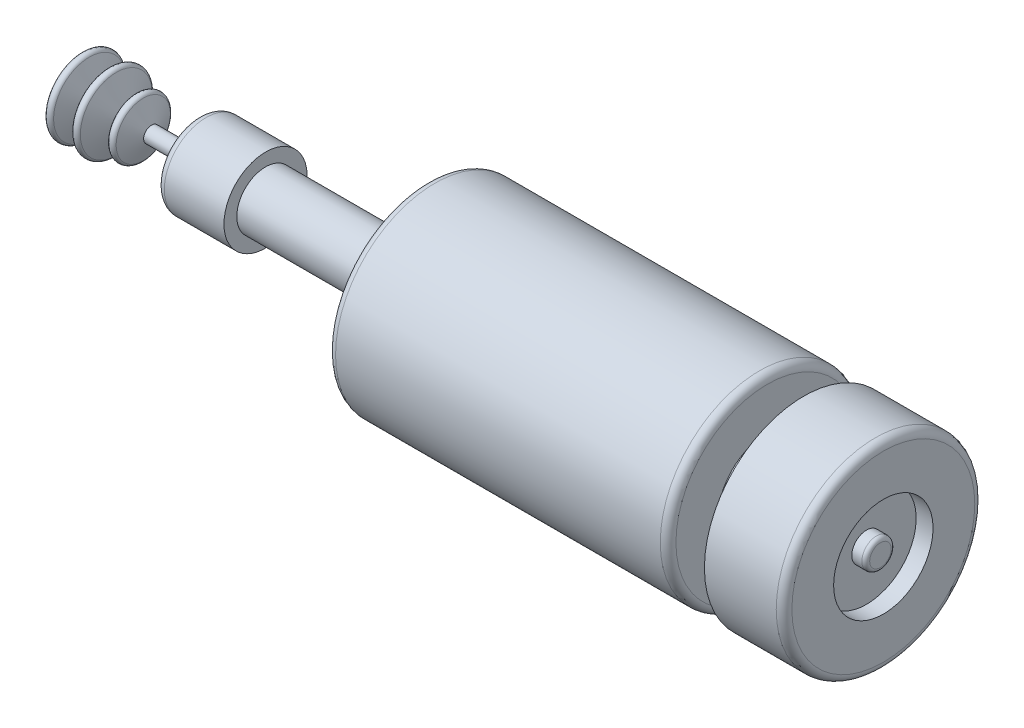
ISO-10303-21;
HEADER;
FILE_DESCRIPTION(('STEP AP214'),'2;1');
FILE_NAME('part.step','',(''),(''),'','','');
FILE_SCHEMA(('AUTOMOTIVE_DESIGN { 1 0 10303 214 1 1 1 1 }'));
ENDSEC;
DATA;
#1=APPLICATION_CONTEXT('core data for automotive mechanical design processes');
#2=APPLICATION_PROTOCOL_DEFINITION('international standard','automotive_design',2000,#1);
#3=PRODUCT_CONTEXT('',#1,'mechanical');
#4=PRODUCT('Part','Part','',(#3));
#5=PRODUCT_RELATED_PRODUCT_CATEGORY('part','',(#4));
#6=PRODUCT_DEFINITION_FORMATION('','',#4);
#7=PRODUCT_DEFINITION_CONTEXT('part definition',#1,'design');
#8=PRODUCT_DEFINITION('design','',#6,#7);
#9=PRODUCT_DEFINITION_SHAPE('','',#8);
#10=(LENGTH_UNIT() NAMED_UNIT(*) SI_UNIT(.MILLI.,.METRE.));
#11=(NAMED_UNIT(*) PLANE_ANGLE_UNIT() SI_UNIT($,.RADIAN.));
#12=(NAMED_UNIT(*) SI_UNIT($,.STERADIAN.) SOLID_ANGLE_UNIT());
#13=UNCERTAINTY_MEASURE_WITH_UNIT(LENGTH_MEASURE(1.E-05),#10,'distance_accuracy_value','');
#14=(GEOMETRIC_REPRESENTATION_CONTEXT(3) GLOBAL_UNCERTAINTY_ASSIGNED_CONTEXT((#13)) GLOBAL_UNIT_ASSIGNED_CONTEXT((#10,
#11,#12)) REPRESENTATION_CONTEXT('',''));
#15=CARTESIAN_POINT('',(0.,0.,0.));
#16=DIRECTION('',(0.,0.,1.));
#17=DIRECTION('',(1.,0.,0.));
#18=AXIS2_PLACEMENT_3D('',#15,#16,#17);
#19=CARTESIAN_POINT('',(-118.607720523507,0.,0.));
#20=DIRECTION('',(1.,0.,0.));
#21=DIRECTION('',(0.,0.,-1.));
#22=AXIS2_PLACEMENT_3D('',#19,#20,#21);
#23=CONICAL_SURFACE('',#22,4.07209805882899,1.50487260472718);
#24=CARTESIAN_POINT('',(-118.876557947232,0.,0.));
#25=VERTEX_POINT('',#24);
#26=VERTEX_LOOP('',#25);
#27=FACE_BOUND('',#26,.T.);
#28=CARTESIAN_POINT('',(-118.607720523507,0.,0.));
#29=DIRECTION('',(-1.,0.,0.));
#30=DIRECTION('',(0.,0.,1.));
#31=AXIS2_PLACEMENT_3D('',#28,#29,#30);
#32=CIRCLE('',#31,4.07209805882899);
#33=CARTESIAN_POINT('',(-118.607720523507,0.,4.07209805882899));
#34=VERTEX_POINT('',#33);
#35=EDGE_CURVE('E53',#34,#34,#32,.T.);
#36=ORIENTED_EDGE('',*,*,#35,.T.);
#37=EDGE_LOOP('',(#36));
#38=FACE_BOUND('',#37,.T.);
#39=ADVANCED_FACE('F39',(#27,#38),#23,.T.);
#40=CARTESIAN_POINT('',(86.761420325875,2.74164683024927,0.));
#41=DIRECTION('',(-1.,0.,0.));
#42=DIRECTION('',(0.,0.,1.));
#43=AXIS2_PLACEMENT_3D('',#40,#41,#42);
#44=PLANE('',#43);
#45=CARTESIAN_POINT('',(86.761420325875,0.,0.));
#46=DIRECTION('',(-1.,0.,0.));
#47=DIRECTION('',(0.,0.,1.));
#48=AXIS2_PLACEMENT_3D('',#45,#46,#47);
#49=CIRCLE('',#48,2.74164683024927);
#50=CARTESIAN_POINT('',(86.761420325875,0.,2.74164683024927));
#51=VERTEX_POINT('',#50);
#52=EDGE_CURVE('E11',#51,#51,#49,.T.);
#53=ORIENTED_EDGE('',*,*,#52,.F.);
#54=EDGE_LOOP('',(#53));
#55=FACE_BOUND('',#54,.T.);
#56=ADVANCED_FACE('F50',(#55),#44,.F.);
#57=CARTESIAN_POINT('',(85.761420325875,0.,0.));
#58=DIRECTION('',(-1.,0.,0.));
#59=DIRECTION('',(0.,0.,1.));
#60=AXIS2_PLACEMENT_3D('',#57,#58,#59);
#61=TOROIDAL_SURFACE('',#60,2.74164683024928,1.);
#62=CARTESIAN_POINT('',(85.761420325875,0.,0.));
#63=DIRECTION('',(-1.,0.,0.));
#64=DIRECTION('',(0.,0.,1.));
#65=AXIS2_PLACEMENT_3D('',#62,#63,#64);
#66=CIRCLE('',#65,3.74164683024928);
#67=CARTESIAN_POINT('',(85.761420325875,0.,3.74164683024928));
#68=VERTEX_POINT('',#67);
#69=EDGE_CURVE('E45',#68,#68,#66,.T.);
#70=ORIENTED_EDGE('',*,*,#69,.F.);
#71=EDGE_LOOP('',(#70));
#72=FACE_BOUND('',#71,.T.);
#73=ORIENTED_EDGE('',*,*,#52,.T.);
#74=EDGE_LOOP('',(#73));
#75=FACE_BOUND('',#74,.T.);
#76=ADVANCED_FACE('F166',(#72,#75),#61,.T.);
#77=CARTESIAN_POINT('',(0.,0.,0.));
#78=DIRECTION('',(-1.,0.,0.));
#79=DIRECTION('',(0.,0.,1.));
#80=AXIS2_PLACEMENT_3D('',#77,#78,#79);
#81=CYLINDRICAL_SURFACE('',#80,3.74164683024928);
#82=CARTESIAN_POINT('',(83.192728647066,0.,0.));
#83=DIRECTION('',(-1.,0.,0.));
#84=DIRECTION('',(0.,0.,1.));
#85=AXIS2_PLACEMENT_3D('',#82,#83,#84);
#86=CIRCLE('',#85,3.74164683024928);
#87=CARTESIAN_POINT('',(83.192728647066,0.,3.74164683024928));
#88=VERTEX_POINT('',#87);
#89=EDGE_CURVE('E159',#88,#88,#86,.T.);
#90=ORIENTED_EDGE('',*,*,#89,.F.);
#91=EDGE_LOOP('',(#90));
#92=FACE_BOUND('',#91,.T.);
#93=ORIENTED_EDGE('',*,*,#69,.T.);
#94=EDGE_LOOP('',(#93));
#95=FACE_BOUND('',#94,.T.);
#96=ADVANCED_FACE('F164',(#92,#95),#81,.T.);
#97=CARTESIAN_POINT('',(83.192728647066,12.6943246652966,0.));
#98=DIRECTION('',(-1.,0.,0.));
#99=DIRECTION('',(0.,0.,1.));
#100=AXIS2_PLACEMENT_3D('',#97,#98,#99);
#101=PLANE('',#100);
#102=CARTESIAN_POINT('',(83.192728647066,0.,0.));
#103=DIRECTION('',(-1.,0.,0.));
#104=DIRECTION('',(0.,0.,1.));
#105=AXIS2_PLACEMENT_3D('',#102,#103,#104);
#106=CIRCLE('',#105,12.6943246652966);
#107=CARTESIAN_POINT('',(83.192728647066,0.,12.6943246652966));
#108=VERTEX_POINT('',#107);
#109=EDGE_CURVE('E156',#108,#108,#106,.T.);
#110=ORIENTED_EDGE('',*,*,#109,.F.);
#111=EDGE_LOOP('',(#110));
#112=FACE_BOUND('',#111,.T.);
#113=ORIENTED_EDGE('',*,*,#89,.T.);
#114=EDGE_LOOP('',(#113));
#115=FACE_BOUND('',#114,.T.);
#116=ADVANCED_FACE('F178',(#112,#115),#101,.F.);
#117=CARTESIAN_POINT('',(0.,0.,0.));
#118=DIRECTION('',(-1.,0.,0.));
#119=DIRECTION('',(0.,0.,1.));
#120=AXIS2_PLACEMENT_3D('',#117,#118,#119);
#121=CYLINDRICAL_SURFACE('',#120,12.6943246652966);
#122=CARTESIAN_POINT('',(87.5,0.,0.));
#123=DIRECTION('',(-1.,0.,0.));
#124=DIRECTION('',(0.,0.,1.));
#125=AXIS2_PLACEMENT_3D('',#122,#123,#124);
#126=CIRCLE('',#125,12.6943246652966);
#127=CARTESIAN_POINT('',(87.5,0.,12.6943246652966));
#128=VERTEX_POINT('',#127);
#129=EDGE_CURVE('E153',#128,#128,#126,.T.);
#130=ORIENTED_EDGE('',*,*,#129,.F.);
#131=EDGE_LOOP('',(#130));
#132=FACE_BOUND('',#131,.T.);
#133=ORIENTED_EDGE('',*,*,#109,.T.);
#134=EDGE_LOOP('',(#133));
#135=FACE_BOUND('',#134,.T.);
#136=ADVANCED_FACE('F182',(#132,#135),#121,.F.);
#137=CARTESIAN_POINT('',(87.5,12.6943246652966,0.));
#138=DIRECTION('',(-1.,0.,0.));
#139=DIRECTION('',(0.,0.,1.));
#140=AXIS2_PLACEMENT_3D('',#137,#138,#139);
#141=PLANE('',#140);
#142=CARTESIAN_POINT('',(87.5,0.,0.));
#143=DIRECTION('',(-1.,0.,0.));
#144=DIRECTION('',(0.,0.,1.));
#145=AXIS2_PLACEMENT_3D('',#142,#143,#144);
#146=CIRCLE('',#145,23.3547064368853);
#147=CARTESIAN_POINT('',(87.5,0.,23.3547064368853));
#148=VERTEX_POINT('',#147);
#149=EDGE_CURVE('E150',#148,#148,#146,.T.);
#150=ORIENTED_EDGE('',*,*,#149,.F.);
#151=EDGE_LOOP('',(#150));
#152=FACE_BOUND('',#151,.T.);
#153=ORIENTED_EDGE('',*,*,#129,.T.);
#154=EDGE_LOOP('',(#153));
#155=FACE_BOUND('',#154,.T.);
#156=ADVANCED_FACE('F186',(#152,#155),#141,.F.);
#157=CARTESIAN_POINT('',(85.5,0.,0.));
#158=DIRECTION('',(-1.,0.,0.));
#159=DIRECTION('',(0.,0.,1.));
#160=AXIS2_PLACEMENT_3D('',#157,#158,#159);
#161=TOROIDAL_SURFACE('',#160,23.3547064368854,2.);
#162=CARTESIAN_POINT('',(85.5,0.,0.));
#163=DIRECTION('',(-1.,0.,0.));
#164=DIRECTION('',(0.,0.,1.));
#165=AXIS2_PLACEMENT_3D('',#162,#163,#164);
#166=CIRCLE('',#165,25.3547064368854);
#167=CARTESIAN_POINT('',(85.5,0.,25.3547064368854));
#168=VERTEX_POINT('',#167);
#169=EDGE_CURVE('E147',#168,#168,#166,.T.);
#170=ORIENTED_EDGE('',*,*,#169,.F.);
#171=EDGE_LOOP('',(#170));
#172=FACE_BOUND('',#171,.T.);
#173=ORIENTED_EDGE('',*,*,#149,.T.);
#174=EDGE_LOOP('',(#173));
#175=FACE_BOUND('',#174,.T.);
#176=ADVANCED_FACE('F190',(#172,#175),#161,.T.);
#177=CARTESIAN_POINT('',(0.,0.,0.));
#178=DIRECTION('',(-1.,0.,0.));
#179=DIRECTION('',(0.,0.,1.));
#180=AXIS2_PLACEMENT_3D('',#177,#178,#179);
#181=CYLINDRICAL_SURFACE('',#180,25.3547064368854);
#182=CARTESIAN_POINT('',(67.1586693630098,0.,0.));
#183=DIRECTION('',(-1.,0.,0.));
#184=DIRECTION('',(0.,0.,1.));
#185=AXIS2_PLACEMENT_3D('',#182,#183,#184);
#186=CIRCLE('',#185,25.3547064368854);
#187=CARTESIAN_POINT('',(67.1586693630098,0.,25.3547064368854));
#188=VERTEX_POINT('',#187);
#189=EDGE_CURVE('E144',#188,#188,#186,.T.);
#190=ORIENTED_EDGE('',*,*,#189,.F.);
#191=EDGE_LOOP('',(#190));
#192=FACE_BOUND('',#191,.T.);
#193=ORIENTED_EDGE('',*,*,#169,.T.);
#194=EDGE_LOOP('',(#193));
#195=FACE_BOUND('',#194,.T.);
#196=ADVANCED_FACE('F194',(#192,#195),#181,.T.);
#197=CARTESIAN_POINT('',(67.1586693630098,25.3547064368854,0.));
#198=DIRECTION('',(1.,0.,0.));
#199=DIRECTION('',(0.,0.,-1.));
#200=AXIS2_PLACEMENT_3D('',#197,#198,#199);
#201=PLANE('',#200);
#202=CARTESIAN_POINT('',(67.1586693630098,0.,0.));
#203=DIRECTION('',(-1.,0.,0.));
#204=DIRECTION('',(0.,0.,1.));
#205=AXIS2_PLACEMENT_3D('',#202,#203,#204);
#206=CIRCLE('',#205,3.74164683024928);
#207=CARTESIAN_POINT('',(67.1586693630098,0.,3.74164683024928));
#208=VERTEX_POINT('',#207);
#209=EDGE_CURVE('E141',#208,#208,#206,.T.);
#210=ORIENTED_EDGE('',*,*,#209,.F.);
#211=EDGE_LOOP('',(#210));
#212=FACE_BOUND('',#211,.T.);
#213=ORIENTED_EDGE('',*,*,#189,.T.);
#214=EDGE_LOOP('',(#213));
#215=FACE_BOUND('',#214,.T.);
#216=ADVANCED_FACE('F198',(#212,#215),#201,.F.);
#217=CARTESIAN_POINT('',(0.,0.,0.));
#218=DIRECTION('',(-1.,0.,0.));
#219=DIRECTION('',(0.,0.,1.));
#220=AXIS2_PLACEMENT_3D('',#217,#218,#219);
#221=CYLINDRICAL_SURFACE('',#220,3.74164683024928);
#222=CARTESIAN_POINT('',(66.701004330178,0.,0.));
#223=DIRECTION('',(-1.,0.,0.));
#224=DIRECTION('',(0.,0.,1.));
#225=AXIS2_PLACEMENT_3D('',#222,#223,#224);
#226=CIRCLE('',#225,3.74164683024928);
#227=CARTESIAN_POINT('',(66.701004330178,0.,3.74164683024928));
#228=VERTEX_POINT('',#227);
#229=EDGE_CURVE('E138',#228,#228,#226,.T.);
#230=ORIENTED_EDGE('',*,*,#229,.F.);
#231=EDGE_LOOP('',(#230));
#232=FACE_BOUND('',#231,.T.);
#233=ORIENTED_EDGE('',*,*,#209,.T.);
#234=EDGE_LOOP('',(#233));
#235=FACE_BOUND('',#234,.T.);
#236=ADVANCED_FACE('F202',(#232,#235),#221,.T.);
#237=CARTESIAN_POINT('',(66.701004330178,3.74164683024928,0.));
#238=DIRECTION('',(-1.,0.,0.));
#239=DIRECTION('',(0.,0.,1.));
#240=AXIS2_PLACEMENT_3D('',#237,#238,#239);
#241=PLANE('',#240);
#242=CARTESIAN_POINT('',(66.701004330178,0.,0.));
#243=DIRECTION('',(-1.,0.,0.));
#244=DIRECTION('',(0.,0.,1.));
#245=AXIS2_PLACEMENT_3D('',#242,#243,#244);
#246=CIRCLE('',#245,4.07209805882899);
#247=CARTESIAN_POINT('',(66.701004330178,0.,4.07209805882899));
#248=VERTEX_POINT('',#247);
#249=EDGE_CURVE('E135',#248,#248,#246,.T.);
#250=ORIENTED_EDGE('',*,*,#249,.F.);
#251=EDGE_LOOP('',(#250));
#252=FACE_BOUND('',#251,.T.);
#253=ORIENTED_EDGE('',*,*,#229,.T.);
#254=EDGE_LOOP('',(#253));
#255=FACE_BOUND('',#254,.T.);
#256=ADVANCED_FACE('F206',(#252,#255),#241,.F.);
#257=CARTESIAN_POINT('',(0.,0.,0.));
#258=DIRECTION('',(-1.,0.,0.));
#259=DIRECTION('',(0.,0.,1.));
#260=AXIS2_PLACEMENT_3D('',#257,#258,#259);
#261=CYLINDRICAL_SURFACE('',#260,4.07209805882899);
#262=CARTESIAN_POINT('',(63.9472515920874,0.,0.));
#263=DIRECTION('',(-1.,0.,0.));
#264=DIRECTION('',(0.,0.,1.));
#265=AXIS2_PLACEMENT_3D('',#262,#263,#264);
#266=CIRCLE('',#265,4.07209805882899);
#267=CARTESIAN_POINT('',(63.9472515920874,0.,4.07209805882899));
#268=VERTEX_POINT('',#267);
#269=EDGE_CURVE('E132',#268,#268,#266,.T.);
#270=ORIENTED_EDGE('',*,*,#269,.F.);
#271=EDGE_LOOP('',(#270));
#272=FACE_BOUND('',#271,.T.);
#273=ORIENTED_EDGE('',*,*,#249,.T.);
#274=EDGE_LOOP('',(#273));
#275=FACE_BOUND('',#274,.T.);
#276=ADVANCED_FACE('F210',(#272,#275),#261,.T.);
#277=CARTESIAN_POINT('',(63.9472515920874,4.07209805882899,0.));
#278=DIRECTION('',(-1.,0.,0.));
#279=DIRECTION('',(0.,0.,1.));
#280=AXIS2_PLACEMENT_3D('',#277,#278,#279);
#281=PLANE('',#280);
#282=CARTESIAN_POINT('',(63.9472515920874,0.,0.));
#283=DIRECTION('',(-1.,0.,0.));
#284=DIRECTION('',(0.,0.,1.));
#285=AXIS2_PLACEMENT_3D('',#282,#283,#284);
#286=CIRCLE('',#285,12.6773532184427);
#287=CARTESIAN_POINT('',(63.9472515920874,0.,12.6773532184427));
#288=VERTEX_POINT('',#287);
#289=EDGE_CURVE('E129',#288,#288,#286,.T.);
#290=ORIENTED_EDGE('',*,*,#289,.F.);
#291=EDGE_LOOP('',(#290));
#292=FACE_BOUND('',#291,.T.);
#293=ORIENTED_EDGE('',*,*,#269,.T.);
#294=EDGE_LOOP('',(#293));
#295=FACE_BOUND('',#294,.T.);
#296=ADVANCED_FACE('F214',(#292,#295),#281,.F.);
#297=CARTESIAN_POINT('',(0.,0.,0.));
#298=DIRECTION('',(-1.,0.,0.));
#299=DIRECTION('',(0.,0.,1.));
#300=AXIS2_PLACEMENT_3D('',#297,#298,#299);
#301=CYLINDRICAL_SURFACE('',#300,12.6773532184427);
#302=CARTESIAN_POINT('',(57.8869531587805,0.,0.));
#303=DIRECTION('',(-1.,0.,0.));
#304=DIRECTION('',(0.,0.,1.));
#305=AXIS2_PLACEMENT_3D('',#302,#303,#304);
#306=CIRCLE('',#305,12.6773532184427);
#307=CARTESIAN_POINT('',(57.8869531587805,0.,12.6773532184427));
#308=VERTEX_POINT('',#307);
#309=EDGE_CURVE('E126',#308,#308,#306,.T.);
#310=ORIENTED_EDGE('',*,*,#309,.F.);
#311=EDGE_LOOP('',(#310));
#312=FACE_BOUND('',#311,.T.);
#313=ORIENTED_EDGE('',*,*,#289,.T.);
#314=EDGE_LOOP('',(#313));
#315=FACE_BOUND('',#314,.T.);
#316=ADVANCED_FACE('F218',(#312,#315),#301,.T.);
#317=CARTESIAN_POINT('',(57.8869531587805,12.6773532184427,0.));
#318=DIRECTION('',(-1.,0.,0.));
#319=DIRECTION('',(0.,0.,1.));
#320=AXIS2_PLACEMENT_3D('',#317,#318,#319);
#321=PLANE('',#320);
#322=CARTESIAN_POINT('',(57.8869531587805,0.,0.));
#323=DIRECTION('',(-1.,0.,0.));
#324=DIRECTION('',(0.,0.,1.));
#325=AXIS2_PLACEMENT_3D('',#322,#323,#324);
#326=CIRCLE('',#325,23.3547064368853);
#327=CARTESIAN_POINT('',(57.8869531587805,0.,23.3547064368853));
#328=VERTEX_POINT('',#327);
#329=EDGE_CURVE('E123',#328,#328,#326,.T.);
#330=ORIENTED_EDGE('',*,*,#329,.F.);
#331=EDGE_LOOP('',(#330));
#332=FACE_BOUND('',#331,.T.);
#333=ORIENTED_EDGE('',*,*,#309,.T.);
#334=EDGE_LOOP('',(#333));
#335=FACE_BOUND('',#334,.T.);
#336=ADVANCED_FACE('F222',(#332,#335),#321,.F.);
#337=CARTESIAN_POINT('',(55.8869531587805,0.,0.));
#338=DIRECTION('',(-1.,0.,0.));
#339=DIRECTION('',(0.,0.,1.));
#340=AXIS2_PLACEMENT_3D('',#337,#338,#339);
#341=TOROIDAL_SURFACE('',#340,23.3547064368854,2.);
#342=CARTESIAN_POINT('',(55.8869531587805,0.,0.));
#343=DIRECTION('',(-1.,0.,0.));
#344=DIRECTION('',(0.,0.,1.));
#345=AXIS2_PLACEMENT_3D('',#342,#343,#344);
#346=CIRCLE('',#345,25.3547064368854);
#347=CARTESIAN_POINT('',(55.8869531587805,0.,25.3547064368854));
#348=VERTEX_POINT('',#347);
#349=EDGE_CURVE('E120',#348,#348,#346,.T.);
#350=ORIENTED_EDGE('',*,*,#349,.F.);
#351=EDGE_LOOP('',(#350));
#352=FACE_BOUND('',#351,.T.);
#353=ORIENTED_EDGE('',*,*,#329,.T.);
#354=EDGE_LOOP('',(#353));
#355=FACE_BOUND('',#354,.T.);
#356=ADVANCED_FACE('F226',(#352,#355),#341,.T.);
#357=CARTESIAN_POINT('',(0.,0.,0.));
#358=DIRECTION('',(-1.,0.,0.));
#359=DIRECTION('',(0.,0.,1.));
#360=AXIS2_PLACEMENT_3D('',#357,#358,#359);
#361=CYLINDRICAL_SURFACE('',#360,25.3547064368854);
#362=CARTESIAN_POINT('',(-27.0482970166725,0.,0.));
#363=DIRECTION('',(-1.,0.,0.));
#364=DIRECTION('',(0.,0.,1.));
#365=AXIS2_PLACEMENT_3D('',#362,#363,#364);
#366=CIRCLE('',#365,25.3547064368854);
#367=CARTESIAN_POINT('',(-27.0482970166725,0.,25.3547064368854));
#368=VERTEX_POINT('',#367);
#369=EDGE_CURVE('E117',#368,#368,#366,.T.);
#370=ORIENTED_EDGE('',*,*,#369,.F.);
#371=EDGE_LOOP('',(#370));
#372=FACE_BOUND('',#371,.T.);
#373=ORIENTED_EDGE('',*,*,#349,.T.);
#374=EDGE_LOOP('',(#373));
#375=FACE_BOUND('',#374,.T.);
#376=ADVANCED_FACE('F230',(#372,#375),#361,.T.);
#377=CARTESIAN_POINT('',(-27.0482970166725,0.,0.));
#378=DIRECTION('',(-1.,0.,0.));
#379=DIRECTION('',(0.,0.,1.));
#380=AXIS2_PLACEMENT_3D('',#377,#378,#379);
#381=TOROIDAL_SURFACE('',#380,23.3547064368854,2.);
#382=CARTESIAN_POINT('',(-29.0482970166725,0.,0.));
#383=DIRECTION('',(-1.,0.,0.));
#384=DIRECTION('',(0.,0.,1.));
#385=AXIS2_PLACEMENT_3D('',#382,#383,#384);
#386=CIRCLE('',#385,23.3547064368853);
#387=CARTESIAN_POINT('',(-29.0482970166725,0.,23.3547064368853));
#388=VERTEX_POINT('',#387);
#389=EDGE_CURVE('E114',#388,#388,#386,.T.);
#390=ORIENTED_EDGE('',*,*,#389,.F.);
#391=EDGE_LOOP('',(#390));
#392=FACE_BOUND('',#391,.T.);
#393=ORIENTED_EDGE('',*,*,#369,.T.);
#394=EDGE_LOOP('',(#393));
#395=FACE_BOUND('',#394,.T.);
#396=ADVANCED_FACE('F234',(#392,#395),#381,.T.);
#397=CARTESIAN_POINT('',(-29.0482970166725,23.3547064368853,0.));
#398=DIRECTION('',(1.,0.,0.));
#399=DIRECTION('',(0.,0.,-1.));
#400=AXIS2_PLACEMENT_3D('',#397,#398,#399);
#401=PLANE('',#400);
#402=CARTESIAN_POINT('',(-29.0482970166725,0.,0.));
#403=DIRECTION('',(-1.,0.,0.));
#404=DIRECTION('',(0.,0.,1.));
#405=AXIS2_PLACEMENT_3D('',#402,#403,#404);
#406=CIRCLE('',#405,12.6773532184427);
#407=CARTESIAN_POINT('',(-29.0482970166725,0.,12.6773532184427));
#408=VERTEX_POINT('',#407);
#409=EDGE_CURVE('E111',#408,#408,#406,.T.);
#410=ORIENTED_EDGE('',*,*,#409,.F.);
#411=EDGE_LOOP('',(#410));
#412=FACE_BOUND('',#411,.T.);
#413=ORIENTED_EDGE('',*,*,#389,.T.);
#414=EDGE_LOOP('',(#413));
#415=FACE_BOUND('',#414,.T.);
#416=ADVANCED_FACE('F238',(#412,#415),#401,.F.);
#417=CARTESIAN_POINT('',(0.,0.,0.));
#418=DIRECTION('',(-1.,0.,0.));
#419=DIRECTION('',(0.,0.,1.));
#420=AXIS2_PLACEMENT_3D('',#417,#418,#419);
#421=CYLINDRICAL_SURFACE('',#420,12.6773532184427);
#422=CARTESIAN_POINT('',(-35.361872750427,0.,0.));
#423=DIRECTION('',(-1.,0.,0.));
#424=DIRECTION('',(0.,0.,1.));
#425=AXIS2_PLACEMENT_3D('',#422,#423,#424);
#426=CIRCLE('',#425,12.6773532184427);
#427=CARTESIAN_POINT('',(-35.361872750427,0.,12.6773532184427));
#428=VERTEX_POINT('',#427);
#429=EDGE_CURVE('E108',#428,#428,#426,.T.);
#430=ORIENTED_EDGE('',*,*,#429,.F.);
#431=EDGE_LOOP('',(#430));
#432=FACE_BOUND('',#431,.T.);
#433=ORIENTED_EDGE('',*,*,#409,.T.);
#434=EDGE_LOOP('',(#433));
#435=FACE_BOUND('',#434,.T.);
#436=ADVANCED_FACE('F242',(#432,#435),#421,.T.);
#437=CARTESIAN_POINT('',(-35.361872750427,12.6773532184427,0.));
#438=DIRECTION('',(1.,0.,0.));
#439=DIRECTION('',(0.,0.,-1.));
#440=AXIS2_PLACEMENT_3D('',#437,#438,#439);
#441=PLANE('',#440);
#442=CARTESIAN_POINT('',(-35.361872750427,0.,0.));
#443=DIRECTION('',(-1.,0.,0.));
#444=DIRECTION('',(0.,0.,1.));
#445=AXIS2_PLACEMENT_3D('',#442,#443,#444);
#446=CIRCLE('',#445,4.07209805882899);
#447=CARTESIAN_POINT('',(-35.361872750427,0.,4.07209805882899));
#448=VERTEX_POINT('',#447);
#449=EDGE_CURVE('E105',#448,#448,#446,.T.);
#450=ORIENTED_EDGE('',*,*,#449,.F.);
#451=EDGE_LOOP('',(#450));
#452=FACE_BOUND('',#451,.T.);
#453=ORIENTED_EDGE('',*,*,#429,.T.);
#454=EDGE_LOOP('',(#453));
#455=FACE_BOUND('',#454,.T.);
#456=ADVANCED_FACE('F246',(#452,#455),#441,.F.);
#457=CARTESIAN_POINT('',(0.,0.,0.));
#458=DIRECTION('',(-1.,0.,0.));
#459=DIRECTION('',(0.,0.,1.));
#460=AXIS2_PLACEMENT_3D('',#457,#458,#459);
#461=CYLINDRICAL_SURFACE('',#460,4.07209805882899);
#462=CARTESIAN_POINT('',(-39.6475819103116,0.,0.));
#463=DIRECTION('',(-1.,0.,0.));
#464=DIRECTION('',(0.,0.,1.));
#465=AXIS2_PLACEMENT_3D('',#462,#463,#464);
#466=CIRCLE('',#465,4.07209805882899);
#467=CARTESIAN_POINT('',(-39.6475819103116,0.,4.07209805882899));
#468=VERTEX_POINT('',#467);
#469=EDGE_CURVE('E102',#468,#468,#466,.T.);
#470=ORIENTED_EDGE('',*,*,#469,.F.);
#471=EDGE_LOOP('',(#470));
#472=FACE_BOUND('',#471,.T.);
#473=ORIENTED_EDGE('',*,*,#449,.T.);
#474=EDGE_LOOP('',(#473));
#475=FACE_BOUND('',#474,.T.);
#476=ADVANCED_FACE('F250',(#472,#475),#461,.T.);
#477=CARTESIAN_POINT('',(-39.6475819103116,4.07209805882899,0.));
#478=DIRECTION('',(-1.,0.,0.));
#479=DIRECTION('',(0.,0.,1.));
#480=AXIS2_PLACEMENT_3D('',#477,#478,#479);
#481=PLANE('',#480);
#482=CARTESIAN_POINT('',(-39.6475819103116,0.,0.));
#483=DIRECTION('',(-1.,0.,0.));
#484=DIRECTION('',(0.,0.,1.));
#485=AXIS2_PLACEMENT_3D('',#482,#483,#484);
#486=CIRCLE('',#485,7.35083025365592);
#487=CARTESIAN_POINT('',(-39.6475819103116,0.,7.35083025365592));
#488=VERTEX_POINT('',#487);
#489=EDGE_CURVE('E99',#488,#488,#486,.T.);
#490=ORIENTED_EDGE('',*,*,#489,.F.);
#491=EDGE_LOOP('',(#490));
#492=FACE_BOUND('',#491,.T.);
#493=ORIENTED_EDGE('',*,*,#469,.T.);
#494=EDGE_LOOP('',(#493));
#495=FACE_BOUND('',#494,.T.);
#496=ADVANCED_FACE('F254',(#492,#495),#481,.F.);
#497=CARTESIAN_POINT('',(0.,0.,0.));
#498=DIRECTION('',(-1.,0.,0.));
#499=DIRECTION('',(0.,0.,1.));
#500=AXIS2_PLACEMENT_3D('',#497,#498,#499);
#501=CYLINDRICAL_SURFACE('',#500,7.35083025365592);
#502=CARTESIAN_POINT('',(-70.2777973765458,0.,0.));
#503=DIRECTION('',(-1.,0.,0.));
#504=DIRECTION('',(0.,0.,1.));
#505=AXIS2_PLACEMENT_3D('',#502,#503,#504);
#506=CIRCLE('',#505,7.35083025365592);
#507=CARTESIAN_POINT('',(-70.2777973765458,0.,7.35083025365592));
#508=VERTEX_POINT('',#507);
#509=EDGE_CURVE('E96',#508,#508,#506,.T.);
#510=ORIENTED_EDGE('',*,*,#509,.F.);
#511=EDGE_LOOP('',(#510));
#512=FACE_BOUND('',#511,.T.);
#513=ORIENTED_EDGE('',*,*,#489,.T.);
#514=EDGE_LOOP('',(#513));
#515=FACE_BOUND('',#514,.T.);
#516=ADVANCED_FACE('F258',(#512,#515),#501,.T.);
#517=CARTESIAN_POINT('',(-70.2777973765458,7.35083025365592,0.));
#518=DIRECTION('',(-1.,0.,0.));
#519=DIRECTION('',(0.,0.,1.));
#520=AXIS2_PLACEMENT_3D('',#517,#518,#519);
#521=PLANE('',#520);
#522=CARTESIAN_POINT('',(-70.2777973765458,0.,0.));
#523=DIRECTION('',(-1.,0.,0.));
#524=DIRECTION('',(0.,0.,1.));
#525=AXIS2_PLACEMENT_3D('',#522,#523,#524);
#526=CIRCLE('',#525,10.6281372582736);
#527=CARTESIAN_POINT('',(-70.2777973765458,0.,10.6281372582736));
#528=VERTEX_POINT('',#527);
#529=EDGE_CURVE('E93',#528,#528,#526,.T.);
#530=ORIENTED_EDGE('',*,*,#529,.F.);
#531=EDGE_LOOP('',(#530));
#532=FACE_BOUND('',#531,.T.);
#533=ORIENTED_EDGE('',*,*,#509,.T.);
#534=EDGE_LOOP('',(#533));
#535=FACE_BOUND('',#534,.T.);
#536=ADVANCED_FACE('F262',(#532,#535),#521,.F.);
#537=CARTESIAN_POINT('',(0.,0.,0.));
#538=DIRECTION('',(-1.,0.,0.));
#539=DIRECTION('',(0.,0.,1.));
#540=AXIS2_PLACEMENT_3D('',#537,#538,#539);
#541=CYLINDRICAL_SURFACE('',#540,10.6281372582736);
#542=CARTESIAN_POINT('',(-85.5,0.,0.));
#543=DIRECTION('',(-1.,0.,0.));
#544=DIRECTION('',(0.,0.,1.));
#545=AXIS2_PLACEMENT_3D('',#542,#543,#544);
#546=CIRCLE('',#545,10.6281372582736);
#547=CARTESIAN_POINT('',(-85.5,0.,10.6281372582736));
#548=VERTEX_POINT('',#547);
#549=EDGE_CURVE('E90',#548,#548,#546,.T.);
#550=ORIENTED_EDGE('',*,*,#549,.F.);
#551=EDGE_LOOP('',(#550));
#552=FACE_BOUND('',#551,.T.);
#553=ORIENTED_EDGE('',*,*,#529,.T.);
#554=EDGE_LOOP('',(#553));
#555=FACE_BOUND('',#554,.T.);
#556=ADVANCED_FACE('F266',(#552,#555),#541,.T.);
#557=CARTESIAN_POINT('',(-85.5,0.,0.));
#558=DIRECTION('',(-1.,0.,0.));
#559=DIRECTION('',(0.,0.,1.));
#560=AXIS2_PLACEMENT_3D('',#557,#558,#559);
#561=TOROIDAL_SURFACE('',#560,8.62813725827356,2.);
#562=CARTESIAN_POINT('',(-87.5,0.,0.));
#563=DIRECTION('',(-1.,0.,0.));
#564=DIRECTION('',(0.,0.,1.));
#565=AXIS2_PLACEMENT_3D('',#562,#563,#564);
#566=CIRCLE('',#565,8.62813725827355);
#567=CARTESIAN_POINT('',(-87.5,0.,8.62813725827355));
#568=VERTEX_POINT('',#567);
#569=EDGE_CURVE('E87',#568,#568,#566,.T.);
#570=ORIENTED_EDGE('',*,*,#569,.F.);
#571=EDGE_LOOP('',(#570));
#572=FACE_BOUND('',#571,.T.);
#573=ORIENTED_EDGE('',*,*,#549,.T.);
#574=EDGE_LOOP('',(#573));
#575=FACE_BOUND('',#574,.T.);
#576=ADVANCED_FACE('F270',(#572,#575),#561,.T.);
#577=CARTESIAN_POINT('',(-87.5,8.62813725827355,0.));
#578=DIRECTION('',(1.,0.,0.));
#579=DIRECTION('',(0.,0.,-1.));
#580=AXIS2_PLACEMENT_3D('',#577,#578,#579);
#581=PLANE('',#580);
#582=CARTESIAN_POINT('',(-87.5,0.,0.));
#583=DIRECTION('',(-1.,0.,0.));
#584=DIRECTION('',(0.,0.,1.));
#585=AXIS2_PLACEMENT_3D('',#582,#583,#584);
#586=CIRCLE('',#585,1.99999999999999);
#587=CARTESIAN_POINT('',(-87.5,0.,1.99999999999999));
#588=VERTEX_POINT('',#587);
#589=EDGE_CURVE('E84',#588,#588,#586,.T.);
#590=ORIENTED_EDGE('',*,*,#589,.F.);
#591=EDGE_LOOP('',(#590));
#592=FACE_BOUND('',#591,.T.);
#593=ORIENTED_EDGE('',*,*,#569,.T.);
#594=EDGE_LOOP('',(#593));
#595=FACE_BOUND('',#594,.T.);
#596=ADVANCED_FACE('F274',(#592,#595),#581,.F.);
#597=CARTESIAN_POINT('',(0.,0.,0.));
#598=DIRECTION('',(-1.,0.,0.));
#599=DIRECTION('',(0.,0.,1.));
#600=AXIS2_PLACEMENT_3D('',#597,#598,#599);
#601=CYLINDRICAL_SURFACE('',#600,1.99999999999999);
#602=CARTESIAN_POINT('',(-99.4233187080855,0.,0.));
#603=DIRECTION('',(-1.,0.,0.));
#604=DIRECTION('',(0.,0.,1.));
#605=AXIS2_PLACEMENT_3D('',#602,#603,#604);
#606=CIRCLE('',#605,1.99999999999999);
#607=CARTESIAN_POINT('',(-99.4233187080855,0.,1.99999999999997));
#608=VERTEX_POINT('',#607);
#609=EDGE_CURVE('E81',#608,#608,#606,.T.);
#610=ORIENTED_EDGE('',*,*,#609,.F.);
#611=EDGE_LOOP('',(#610));
#612=FACE_BOUND('',#611,.T.);
#613=ORIENTED_EDGE('',*,*,#589,.T.);
#614=EDGE_LOOP('',(#613));
#615=FACE_BOUND('',#614,.T.);
#616=ADVANCED_FACE('F278',(#612,#615),#601,.T.);
#617=CARTESIAN_POINT('',(-99.4233187080855,0.,0.));
#618=DIRECTION('',(-1.,0.,0.));
#619=DIRECTION('',(0.,0.,1.));
#620=AXIS2_PLACEMENT_3D('',#617,#618,#619);
#621=CONICAL_SURFACE('',#620,1.99999999999999,1.16768384003499);
#622=CARTESIAN_POINT('',(-101.520739589214,0.,0.));
#623=DIRECTION('',(-1.,0.,0.));
#624=DIRECTION('',(0.,0.,1.));
#625=AXIS2_PLACEMENT_3D('',#622,#623,#624);
#626=CIRCLE('',#625,6.91813262720965);
#627=CARTESIAN_POINT('',(-101.520739589214,0.,6.91813262720963));
#628=VERTEX_POINT('',#627);
#629=EDGE_CURVE('E78',#628,#628,#626,.T.);
#630=CARTESIAN_POINT('',(-101.520739589214,0.,6.91813262720963));
#631=CARTESIAN_POINT('',(-101.498891455035,0.,6.86690207900953));
#632=CARTESIAN_POINT('',(-101.477043320857,0.,6.81567153080943));
#633=CARTESIAN_POINT('',(-101.4333470525,0.,6.71321043440923));
#634=CARTESIAN_POINT('',(-101.411498918322,0.,6.66197988620913));
#635=CARTESIAN_POINT('',(-101.367802649965,0.,6.55951878980893));
#636=CARTESIAN_POINT('',(-101.345954515786,0.,6.50828824160883));
#637=CARTESIAN_POINT('',(-101.30225824743,0.,6.40582714520863));
#638=CARTESIAN_POINT('',(-101.280410113251,0.,6.35459659700853));
#639=CARTESIAN_POINT('',(-101.236713844894,0.,6.25213550060833));
#640=CARTESIAN_POINT('',(-101.214865710716,0.,6.20090495240822));
#641=CARTESIAN_POINT('',(-101.171169442359,0.,6.09844385600802));
#642=CARTESIAN_POINT('',(-101.149321308181,0.,6.04721330780792));
#643=CARTESIAN_POINT('',(-101.105625039824,0.,5.94475221140772));
#644=CARTESIAN_POINT('',(-101.083776905645,0.,5.89352166320762));
#645=CARTESIAN_POINT('',(-101.040080637289,0.,5.79106056680742));
#646=CARTESIAN_POINT('',(-101.01823250311,0.,5.73983001860732));
#647=CARTESIAN_POINT('',(-100.974536234753,0.,5.63736892220712));
#648=CARTESIAN_POINT('',(-100.952688100575,0.,5.58613837400702));
#649=CARTESIAN_POINT('',(-100.908991832218,0.,5.48367727760682));
#650=CARTESIAN_POINT('',(-100.88714369804,0.,5.43244672940672));
#651=CARTESIAN_POINT('',(-100.843447429683,0.,5.32998563300651));
#652=CARTESIAN_POINT('',(-100.821599295504,0.,5.27875508480641));
#653=CARTESIAN_POINT('',(-100.777903027148,0.,5.17629398840621));
#654=CARTESIAN_POINT('',(-100.756054892969,0.,5.12506344020611));
#655=CARTESIAN_POINT('',(-100.712358624612,0.,5.02260234380591));
#656=CARTESIAN_POINT('',(-100.690510490434,0.,4.97137179560581));
#657=CARTESIAN_POINT('',(-100.646814222077,0.,4.86891069920561));
#658=CARTESIAN_POINT('',(-100.624966087899,0.,4.81768015100551));
#659=CARTESIAN_POINT('',(-100.581269819542,0.,4.71521905460531));
#660=CARTESIAN_POINT('',(-100.559421685363,0.,4.66398850640521));
#661=CARTESIAN_POINT('',(-100.515725417007,0.,4.561527410005));
#662=CARTESIAN_POINT('',(-100.493877282828,0.,4.5102968618049));
#663=CARTESIAN_POINT('',(-100.450181014471,0.,4.4078357654047));
#664=CARTESIAN_POINT('',(-100.428332880293,0.,4.3566052172046));
#665=CARTESIAN_POINT('',(-100.384636611936,0.,4.2541441208044));
#666=CARTESIAN_POINT('',(-100.362788477758,0.,4.2029135726043));
#667=CARTESIAN_POINT('',(-100.319092209401,0.,4.1004524762041));
#668=CARTESIAN_POINT('',(-100.297244075222,0.,4.049221928004));
#669=CARTESIAN_POINT('',(-100.253547806865,0.,3.9467608316038));
#670=CARTESIAN_POINT('',(-100.231699672687,0.,3.89553028340369));
#671=CARTESIAN_POINT('',(-100.18800340433,0.,3.79306918700349));
#672=CARTESIAN_POINT('',(-100.166155270152,0.,3.74183863880339));
#673=CARTESIAN_POINT('',(-100.122459001795,0.,3.63937754240319));
#674=CARTESIAN_POINT('',(-100.100610867617,0.,3.58814699420309));
#675=CARTESIAN_POINT('',(-100.05691459926,0.,3.48568589780289));
#676=CARTESIAN_POINT('',(-100.035066465081,0.,3.43445534960279));
#677=CARTESIAN_POINT('',(-99.9913701967244,0.,3.33199425320259));
#678=CARTESIAN_POINT('',(-99.969522062546,0.,3.28076370500249));
#679=CARTESIAN_POINT('',(-99.9258257941892,0.,3.17830260860229));
#680=CARTESIAN_POINT('',(-99.9039776600108,0.,3.12707206040219));
#681=CARTESIAN_POINT('',(-99.8602813916539,0.,3.02461096400198));
#682=CARTESIAN_POINT('',(-99.8384332574755,0.,2.97338041580188));
#683=CARTESIAN_POINT('',(-99.7947369891187,0.,2.87091931940168));
#684=CARTESIAN_POINT('',(-99.7728888549402,0.,2.81968877120158));
#685=CARTESIAN_POINT('',(-99.7291925865834,0.,2.71722767480138));
#686=CARTESIAN_POINT('',(-99.707344452405,0.,2.66599712660128));
#687=CARTESIAN_POINT('',(-99.6636481840481,0.,2.56353603020108));
#688=CARTESIAN_POINT('',(-99.6418000498697,0.,2.51230548200098));
#689=CARTESIAN_POINT('',(-99.5981037815129,0.,2.40984438560078));
#690=CARTESIAN_POINT('',(-99.5762556473344,0.,2.35861383740068));
#691=CARTESIAN_POINT('',(-99.5325593789776,0.,2.25615274100048));
#692=CARTESIAN_POINT('',(-99.5107112447992,0.,2.20492219280038));
#693=CARTESIAN_POINT('',(-99.4670149764424,0.,2.10246109640017));
#694=CARTESIAN_POINT('',(-99.4451668422639,0.,2.05123054820007));
#695=CARTESIAN_POINT('',(-99.4233187080855,0.,1.99999999999997));
#696=B_SPLINE_CURVE_WITH_KNOTS('',3,(#630,#631,#632,#633,#634,#635,#636,#637,#638,#639,#640,
#641,#642,#643,#644,#645,#646,#647,#648,#649,#650,#651,#652,#653,#654,#655,#656,#657,#658,#659,
#660,#661,#662,#663,#664,#665,#666,#667,#668,#669,#670,#671,#672,#673,#674,#675,#676,#677,#678,
#679,#680,#681,#682,#683,#684,#685,#686,#687,#688,#689,#690,#691,#692,#693,#694,#695),
.UNSPECIFIED.,.F.,.F.,(4,2,2,2,2,2,2,2,2,2,2,2,2,2,2,2,2,2,2,2,2,2,2,2,2,2,2,2,2,2,2,2,4),(0.,
0.167084380848867,0.334168761697734,0.501253142546605,0.668337523395472,0.835421904244339,
1.00250628509321,1.16959066594208,1.33667504679094,1.50375942763982,1.67084380848868,
1.83792818933755,2.00501257018642,2.17209695103529,2.33918133188416,2.50626571273303,
2.6733500935819,2.84043447443076,3.00751885527963,3.1746032361285,3.34168761697737,
3.50877199782624,3.67585637867511,3.84294075952397,4.01002514037285,4.17710952122171,
4.34419390207058,4.51127828291945,4.67836266376832,4.84544704461719,5.01253142546606,
5.17961580631493,5.34670018716379),.UNSPECIFIED.);
#697=EDGE_CURVE('BSEAM282',#628,#608,#696,.T.);
#698=ORIENTED_EDGE('',*,*,#629,.F.);
#699=ORIENTED_EDGE('',*,*,#609,.T.);
#700=ORIENTED_EDGE('',*,*,#697,.T.);
#701=ORIENTED_EDGE('',*,*,#697,.F.);
#702=EDGE_LOOP('',(#698,#700,#699,#701));
#703=FACE_BOUND('',#702,.T.);
#704=ADVANCED_FACE('F282',(#703),#621,.T.);
#705=CARTESIAN_POINT('',(-102.44058406432,0.,0.));
#706=DIRECTION('',(-1.,0.,0.));
#707=DIRECTION('',(0.,0.,1.));
#708=AXIS2_PLACEMENT_3D('',#705,#706,#707);
#709=TOROIDAL_SURFACE('',#708,6.52584938563877,1.);
#710=CARTESIAN_POINT('',(-103.274886898209,0.,0.));
#711=DIRECTION('',(-1.,0.,0.));
#712=DIRECTION('',(0.,0.,1.));
#713=AXIS2_PLACEMENT_3D('',#710,#711,#712);
#714=CIRCLE('',#713,7.07715581709496);
#715=CARTESIAN_POINT('',(-103.274886898209,0.,7.07715581709496));
#716=VERTEX_POINT('',#715);
#717=EDGE_CURVE('E75',#716,#716,#714,.T.);
#718=ORIENTED_EDGE('',*,*,#717,.F.);
#719=EDGE_LOOP('',(#718));
#720=FACE_BOUND('',#719,.T.);
#721=ORIENTED_EDGE('',*,*,#629,.T.);
#722=EDGE_LOOP('',(#721));
#723=FACE_BOUND('',#722,.T.);
#724=ADVANCED_FACE('F286',(#720,#723),#709,.T.);
#725=CARTESIAN_POINT('',(-103.274886898209,0.,0.));
#726=DIRECTION('',(1.,0.,0.));
#727=DIRECTION('',(0.,0.,-1.));
#728=AXIS2_PLACEMENT_3D('',#725,#726,#727);
#729=CONICAL_SURFACE('',#728,7.07715581709496,0.986867001616962);
#730=CARTESIAN_POINT('',(-105.853810989898,0.,0.));
#731=DIRECTION('',(-1.,0.,0.));
#732=DIRECTION('',(0.,0.,1.));
#733=AXIS2_PLACEMENT_3D('',#730,#731,#732);
#734=CIRCLE('',#733,3.17441941621998);
#735=CARTESIAN_POINT('',(-105.853810989898,0.,3.17441941621998));
#736=VERTEX_POINT('',#735);
#737=EDGE_CURVE('E72',#736,#736,#734,.T.);
#738=ORIENTED_EDGE('',*,*,#737,.F.);
#739=EDGE_LOOP('',(#738));
#740=FACE_BOUND('',#739,.T.);
#741=ORIENTED_EDGE('',*,*,#717,.T.);
#742=EDGE_LOOP('',(#741));
#743=FACE_BOUND('',#742,.T.);
#744=ADVANCED_FACE('F290',(#740,#743),#729,.T.);
#745=CARTESIAN_POINT('',(-105.853810989898,0.,0.));
#746=DIRECTION('',(-1.,0.,0.));
#747=DIRECTION('',(0.,0.,1.));
#748=AXIS2_PLACEMENT_3D('',#745,#746,#747);
#749=CONICAL_SURFACE('',#748,3.17441941621998,1.16768384003499);
#750=CARTESIAN_POINT('',(-108.411929048866,0.,0.));
#751=DIRECTION('',(-1.,0.,0.));
#752=DIRECTION('',(0.,0.,1.));
#753=AXIS2_PLACEMENT_3D('',#750,#751,#752);
#754=CIRCLE('',#753,9.17281678284453);
#755=CARTESIAN_POINT('',(-108.411929048866,0.,9.17281678284453));
#756=VERTEX_POINT('',#755);
#757=EDGE_CURVE('E69',#756,#756,#754,.T.);
#758=ORIENTED_EDGE('',*,*,#757,.F.);
#759=EDGE_LOOP('',(#758));
#760=FACE_BOUND('',#759,.T.);
#761=ORIENTED_EDGE('',*,*,#737,.T.);
#762=EDGE_LOOP('',(#761));
#763=FACE_BOUND('',#762,.T.);
#764=ADVANCED_FACE('F294',(#760,#763),#749,.T.);
#765=CARTESIAN_POINT('',(-109.331773523971,0.,0.));
#766=DIRECTION('',(-1.,0.,0.));
#767=DIRECTION('',(0.,0.,1.));
#768=AXIS2_PLACEMENT_3D('',#765,#766,#767);
#769=TOROIDAL_SURFACE('',#768,8.78053354127364,0.999999999999999);
#770=CARTESIAN_POINT('',(-110.16607635786,0.,0.));
#771=DIRECTION('',(-1.,0.,0.));
#772=DIRECTION('',(0.,0.,1.));
#773=AXIS2_PLACEMENT_3D('',#770,#771,#772);
#774=CIRCLE('',#773,9.33183997272984);
#775=CARTESIAN_POINT('',(-110.16607635786,0.,9.33183997272984));
#776=VERTEX_POINT('',#775);
#777=EDGE_CURVE('E66',#776,#776,#774,.T.);
#778=ORIENTED_EDGE('',*,*,#777,.F.);
#779=EDGE_LOOP('',(#778));
#780=FACE_BOUND('',#779,.T.);
#781=ORIENTED_EDGE('',*,*,#757,.T.);
#782=EDGE_LOOP('',(#781));
#783=FACE_BOUND('',#782,.T.);
#784=ADVANCED_FACE('F298',(#780,#783),#769,.T.);
#785=CARTESIAN_POINT('',(-110.16607635786,0.,0.));
#786=DIRECTION('',(1.,0.,0.));
#787=DIRECTION('',(0.,0.,-1.));
#788=AXIS2_PLACEMENT_3D('',#785,#786,#787);
#789=CONICAL_SURFACE('',#788,9.33183997272984,0.986867001616961);
#790=CARTESIAN_POINT('',(-113.332355506967,0.,0.));
#791=DIRECTION('',(-1.,0.,0.));
#792=DIRECTION('',(0.,0.,1.));
#793=AXIS2_PLACEMENT_3D('',#790,#791,#792);
#794=CIRCLE('',#793,4.54024764538256);
#795=CARTESIAN_POINT('',(-113.332355506967,0.,4.54024764538256));
#796=VERTEX_POINT('',#795);
#797=EDGE_CURVE('E63',#796,#796,#794,.T.);
#798=ORIENTED_EDGE('',*,*,#797,.F.);
#799=EDGE_LOOP('',(#798));
#800=FACE_BOUND('',#799,.T.);
#801=ORIENTED_EDGE('',*,*,#777,.T.);
#802=EDGE_LOOP('',(#801));
#803=FACE_BOUND('',#802,.T.);
#804=ADVANCED_FACE('F302',(#800,#803),#789,.T.);
#805=CARTESIAN_POINT('',(-113.332355506967,0.,0.));
#806=DIRECTION('',(-1.,0.,0.));
#807=DIRECTION('',(0.,0.,1.));
#808=AXIS2_PLACEMENT_3D('',#805,#806,#807);
#809=CONICAL_SURFACE('',#808,4.54024764538256,1.16768384003499);
#810=CARTESIAN_POINT('',(-115.287928346044,0.,0.));
#811=DIRECTION('',(-1.,0.,0.));
#812=DIRECTION('',(0.,0.,1.));
#813=AXIS2_PLACEMENT_3D('',#810,#811,#812);
#814=CIRCLE('',#813,9.12576821080046);
#815=CARTESIAN_POINT('',(-115.287928346044,0.,9.12576821080046));
#816=VERTEX_POINT('',#815);
#817=EDGE_CURVE('E58',#816,#816,#814,.T.);
#818=ORIENTED_EDGE('',*,*,#817,.F.);
#819=EDGE_LOOP('',(#818));
#820=FACE_BOUND('',#819,.T.);
#821=ORIENTED_EDGE('',*,*,#797,.T.);
#822=EDGE_LOOP('',(#821));
#823=FACE_BOUND('',#822,.T.);
#824=ADVANCED_FACE('F306',(#820,#823),#809,.T.);
#825=CARTESIAN_POINT('',(-116.20777282115,0.,0.));
#826=DIRECTION('',(-1.,0.,0.));
#827=DIRECTION('',(0.,0.,1.));
#828=AXIS2_PLACEMENT_3D('',#825,#826,#827);
#829=TOROIDAL_SURFACE('',#828,8.73348496922959,1.);
#830=CARTESIAN_POINT('',(-117.167840173397,0.,0.));
#831=DIRECTION('',(-1.,0.,0.));
#832=DIRECTION('',(0.,0.,1.));
#833=AXIS2_PLACEMENT_3D('',#830,#831,#832);
#834=CIRCLE('',#833,9.01325394382904);
#835=CARTESIAN_POINT('',(-117.167840173397,0.,9.01325394382904));
#836=VERTEX_POINT('',#835);
#837=EDGE_CURVE('E55',#836,#836,#834,.T.);
#838=ORIENTED_EDGE('',*,*,#837,.F.);
#839=EDGE_LOOP('',(#838));
#840=FACE_BOUND('',#839,.T.);
#841=ORIENTED_EDGE('',*,*,#817,.T.);
#842=EDGE_LOOP('',(#841));
#843=FACE_BOUND('',#842,.T.);
#844=ADVANCED_FACE('F310',(#840,#843),#829,.T.);
#845=CARTESIAN_POINT('',(-117.167840173397,0.,0.));
#846=DIRECTION('',(1.,0.,0.));
#847=DIRECTION('',(0.,0.,-1.));
#848=AXIS2_PLACEMENT_3D('',#845,#846,#847);
#849=CONICAL_SURFACE('',#848,9.01325394382904,1.28724286060269);
#850=ORIENTED_EDGE('',*,*,#35,.F.);
#851=EDGE_LOOP('',(#850));
#852=FACE_BOUND('',#851,.T.);
#853=ORIENTED_EDGE('',*,*,#837,.T.);
#854=EDGE_LOOP('',(#853));
#855=FACE_BOUND('',#854,.T.);
#856=ADVANCED_FACE('F314',(#852,#855),#849,.T.);
#857=CLOSED_SHELL('',(#39,#56,#76,#96,#116,#136,#156,#176,#196,#216,#236,#256,#276,#296,#316,
#336,#356,#376,#396,#416,#436,#456,#476,#496,#516,#536,#556,#576,#596,#616,#704,#724,#744,#764,
#784,#804,#824,#844,#856));
#858=MANIFOLD_SOLID_BREP('B2',#857);
#859=ADVANCED_BREP_SHAPE_REPRESENTATION('',(#18,#858),#14);
#860=SHAPE_DEFINITION_REPRESENTATION(#9,#859);
ENDSEC;
END-ISO-10303-21;
